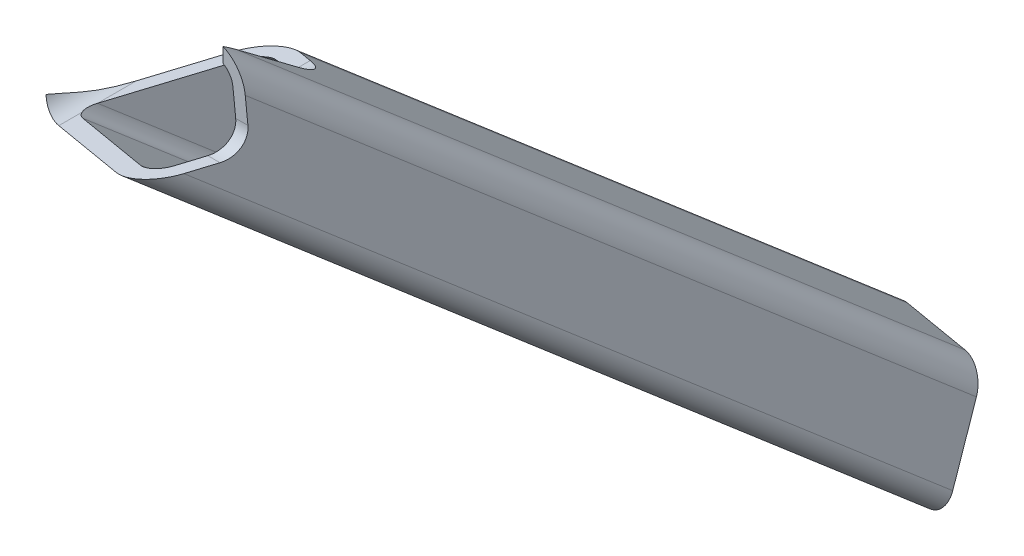
ISO-10303-21;
HEADER;
FILE_DESCRIPTION(('STEP AP214'),'2;1');
FILE_NAME('part.step','',(''),(''),'','','');
FILE_SCHEMA(('AUTOMOTIVE_DESIGN { 1 0 10303 214 1 1 1 1 }'));
ENDSEC;
DATA;
#1=APPLICATION_CONTEXT('core data for automotive mechanical design processes');
#2=APPLICATION_PROTOCOL_DEFINITION('international standard','automotive_design',2000,#1);
#3=PRODUCT_CONTEXT('',#1,'mechanical');
#4=PRODUCT('Part','Part','',(#3));
#5=PRODUCT_RELATED_PRODUCT_CATEGORY('part','',(#4));
#6=PRODUCT_DEFINITION_FORMATION('','',#4);
#7=PRODUCT_DEFINITION_CONTEXT('part definition',#1,'design');
#8=PRODUCT_DEFINITION('design','',#6,#7);
#9=PRODUCT_DEFINITION_SHAPE('','',#8);
#10=(LENGTH_UNIT() NAMED_UNIT(*) SI_UNIT(.MILLI.,.METRE.));
#11=(NAMED_UNIT(*) PLANE_ANGLE_UNIT() SI_UNIT($,.RADIAN.));
#12=(NAMED_UNIT(*) SI_UNIT($,.STERADIAN.) SOLID_ANGLE_UNIT());
#13=UNCERTAINTY_MEASURE_WITH_UNIT(LENGTH_MEASURE(1.E-05),#10,'distance_accuracy_value','');
#14=(GEOMETRIC_REPRESENTATION_CONTEXT(3) GLOBAL_UNCERTAINTY_ASSIGNED_CONTEXT((#13)) GLOBAL_UNIT_ASSIGNED_CONTEXT((#10,
#11,#12)) REPRESENTATION_CONTEXT('',''));
#15=CARTESIAN_POINT('',(0.,0.,0.));
#16=DIRECTION('',(0.,0.,1.));
#17=DIRECTION('',(1.,0.,0.));
#18=AXIS2_PLACEMENT_3D('',#15,#16,#17);
#19=CARTESIAN_POINT('',(-156.509288015,-6.98142396999998,-447.01857603));
#20=DIRECTION('',(0.101857603000028,0.796284793999944,-0.596284793999943));
#21=DIRECTION('',(0.,0.599402291854355,0.800447932422682));
#22=AXIS2_PLACEMENT_3D('',#19,#20,#21);
#23=PLANE('',#22);
#24=DIRECTION('',(0.985721919281302,0.,0.168381405886715));
#25=VECTOR('',#24,1.);
#26=CARTESIAN_POINT('',(-155.840227574181,-10.,-450.935324072141));
#27=LINE('',#26,#25);
#28=CARTESIAN_POINT('',(-155.,-10.,-450.7917960675));
#29=VERTEX_POINT('',#28);
#30=CARTESIAN_POINT('',(-143.,-9.99999999999995,-448.741951348501));
#31=VERTEX_POINT('',#30);
#32=EDGE_CURVE('E463',#29,#31,#27,.T.);
#33=ORIENTED_EDGE('',*,*,#32,.T.);
#34=DIRECTION('',(0.298142396999973,-0.596284793999944,-0.74535599249993));
#35=VECTOR('',#34,1.);
#36=CARTESIAN_POINT('',(-145.120433633,-5.7591327339995,-443.440867266001));
#37=LINE('',#36,#35);
#38=CARTESIAN_POINT('',(-104.,-88.0000000000001,-546.241951348501));
#39=VERTEX_POINT('',#38);
#40=EDGE_CURVE('E402',#31,#39,#37,.T.);
#41=ORIENTED_EDGE('',*,*,#40,.T.);
#42=DIRECTION('',(-0.985721919281302,0.,-0.168381405886715));
#43=VECTOR('',#42,1.);
#44=CARTESIAN_POINT('',(-138.551706806355,-88.0000000000002,-552.144087492619));
#45=LINE('',#44,#43);
#46=CARTESIAN_POINT('',(-116.,-88.0000000000002,-548.291796067501));
#47=VERTEX_POINT('',#46);
#48=EDGE_CURVE('E404',#39,#47,#45,.T.);
#49=ORIENTED_EDGE('',*,*,#48,.T.);
#50=DIRECTION('',(0.298142396999973,-0.596284793999944,-0.74535599249993));
#51=VECTOR('',#50,1.);
#52=CARTESIAN_POINT('',(-156.509288015,-6.98142396999998,-447.01857603));
#53=LINE('',#52,#51);
#54=EDGE_CURVE('E405',#29,#47,#53,.T.);
#55=ORIENTED_EDGE('',*,*,#54,.F.);
#56=EDGE_LOOP('',(#33,#41,#49,#55));
#57=FACE_BOUND('',#56,.T.);
#58=ADVANCED_FACE('F41',(#57),#23,.T.);
#59=CARTESIAN_POINT('',(-144.916718427,-4.16656314599959,-444.633436854));
#60=DIRECTION('',(0.298142396999973,-0.596284793999944,-0.74535599249993));
#61=DIRECTION('',(0.,0.78086880944303,-0.624695047554424));
#62=AXIS2_PLACEMENT_3D('',#59,#60,#61);
#63=CYLINDRICAL_SURFACE('',#62,2.);
#64=ORIENTED_EDGE('',*,*,#40,.F.);
#65=CARTESIAN_POINT('',(-142.,-10.,-451.925232921501));
#66=DIRECTION('',(0.,1.,0.));
#67=DIRECTION('',(0.371390676354104,0.,-0.928476690885259));
#68=AXIS2_PLACEMENT_3D('',#65,#66,#67);
#69=ELLIPSE('',#68,3.35410196624969,2.);
#70=CARTESIAN_POINT('',(-140.,-10.,-451.583592135001));
#71=VERTEX_POINT('',#70);
#72=EDGE_CURVE('E236',#31,#71,#69,.T.);
#73=ORIENTED_EDGE('',*,*,#72,.T.);
#74=DIRECTION('',(0.298142396999973,-0.596284793999944,-0.74535599249993));
#75=VECTOR('',#74,1.);
#76=CARTESIAN_POINT('',(-143.018576030001,-3.96284793999965,-444.03715206));
#77=LINE('',#76,#75);
#78=CARTESIAN_POINT('',(-102.,-86.0000000000003,-546.583592135001));
#79=VERTEX_POINT('',#78);
#80=EDGE_CURVE('E234',#71,#79,#77,.T.);
#81=ORIENTED_EDGE('',*,*,#80,.T.);
#82=CARTESIAN_POINT('',(-104.,-86.0000000000001,-546.925232921501));
#83=DIRECTION('',(0.159575689721233,-0.319151379442464,-0.934172358962716));
#84=DIRECTION('',(0.417774579468394,-0.835549158936787,0.35682208977309));
#85=AXIS2_PLACEMENT_3D('',#82,#83,#84);
#86=ELLIPSE('',#85,2.14093253863854,2.);
#87=EDGE_CURVE('E401',#79,#39,#86,.T.);
#88=ORIENTED_EDGE('',*,*,#87,.T.);
#89=EDGE_LOOP('',(#64,#73,#81,#88));
#90=FACE_BOUND('',#89,.T.);
#91=ADVANCED_FACE('F321',(#90),#63,.F.);
#92=CARTESIAN_POINT('',(-141.796284794,5.59256958799983,-451.192569588));
#93=DIRECTION('',(-0.949071198499986,-0.101857603000028,-0.298142396999973));
#94=DIRECTION('',(-0.299701145927178,0.,0.954033135236893));
#95=AXIS2_PLACEMENT_3D('',#92,#93,#94);
#96=PLANE('',#95);
#97=ORIENTED_EDGE('',*,*,#80,.F.);
#98=DIRECTION('',(0.299701145927178,0.,-0.954033135236893));
#99=VECTOR('',#98,1.);
#100=CARTESIAN_POINT('',(-140.273146748563,-10.,-450.714089123577));
#101=LINE('',#100,#99);
#102=CARTESIAN_POINT('',(-138.612624185539,-10.,-456.));
#103=VERTEX_POINT('',#102);
#104=EDGE_CURVE('E227',#71,#103,#101,.T.);
#105=ORIENTED_EDGE('',*,*,#104,.T.);
#106=CARTESIAN_POINT('',(-139.041918017914,-6.00000000000001,-456.));
#107=DIRECTION('',(-0.949071198499986,-0.101857603000028,-0.298142396999973));
#108=DIRECTION('',(0.31506167678377,-0.306829184502558,-0.898104666149606));
#109=AXIS2_PLACEMENT_3D('',#106,#107,#108);
#110=ELLIPSE('',#109,4.21464691618715,4.);
#111=CARTESIAN_POINT('',(-137.785353083813,-6.,-460.));
#112=VERTEX_POINT('',#111);
#113=EDGE_CURVE('E210',#103,#112,#110,.F.);
#114=ORIENTED_EDGE('',*,*,#113,.T.);
#115=DIRECTION('',(-0.106710653684535,0.9942901168121,0.));
#116=VECTOR('',#115,1.);
#117=CARTESIAN_POINT('',(-139.061013483171,5.88612836390215,-460.));
#118=LINE('',#117,#116);
#119=CARTESIAN_POINT('',(-138.2733126292,-1.45337474160038,-460.));
#120=VERTEX_POINT('',#119);
#121=EDGE_CURVE('E250',#112,#120,#118,.T.);
#122=ORIENTED_EDGE('',*,*,#121,.T.);
#123=DIRECTION('',(0.298142396999973,-0.596284793999944,-0.74535599249993));
#124=VECTOR('',#123,1.);
#125=CARTESIAN_POINT('',(-141.796284794,5.59256958799983,-451.192569588));
#126=LINE('',#125,#124);
#127=CARTESIAN_POINT('',(-102.,-74.0000000000001,-550.683281573));
#128=VERTEX_POINT('',#127);
#129=EDGE_CURVE('E397',#120,#128,#126,.T.);
#130=ORIENTED_EDGE('',*,*,#129,.T.);
#131=DIRECTION('',(0.,-0.94629851540018,0.32329416906498));
#132=VECTOR('',#131,1.);
#133=CARTESIAN_POINT('',(-102.,-33.1638470419887,-564.634576987204));
#134=LINE('',#133,#132);
#135=EDGE_CURVE('E399',#128,#79,#134,.T.);
#136=ORIENTED_EDGE('',*,*,#135,.T.);
#137=EDGE_LOOP('',(#97,#105,#114,#122,#130,#136));
#138=FACE_BOUND('',#137,.T.);
#139=ADVANCED_FACE('F232',(#138),#96,.T.);
#140=CARTESIAN_POINT('',(-143.694427191,5.38885438199968,-451.788854382));
#141=DIRECTION('',(0.298142396999973,-0.596284793999944,-0.74535599249993));
#142=DIRECTION('',(0.,0.78086880944303,-0.624695047554424));
#143=AXIS2_PLACEMENT_3D('',#140,#141,#142);
#144=CYLINDRICAL_SURFACE('',#143,2.);
#145=ORIENTED_EDGE('',*,*,#129,.F.);
#146=CARTESIAN_POINT('',(-140.4099689438,-1.18006211240055,-460.));
#147=DIRECTION('',(0.,0.,1.));
#148=DIRECTION('',(0.447213595499959,-0.894427190999916,0.));
#149=AXIS2_PLACEMENT_3D('',#146,#147,#148);
#150=ELLIPSE('',#149,2.68328157299975,2.);
#151=CARTESIAN_POINT('',(-140.,1.15266891727429,-460.));
#152=VERTEX_POINT('',#151);
#153=EDGE_CURVE('E247',#120,#152,#150,.T.);
#154=ORIENTED_EDGE('',*,*,#153,.T.);
#155=CARTESIAN_POINT('',(-140.,-2.00000000000018,-461.0249223595));
#156=DIRECTION('',(-1.,0.,0.));
#157=DIRECTION('',(0.,-0.624695047554424,-0.780868809443031));
#158=AXIS2_PLACEMENT_3D('',#155,#156,#157);
#159=ELLIPSE('',#158,6.70820393249936,2.);
#160=CARTESIAN_POINT('',(-140.,0.,-461.708203932499));
#161=VERTEX_POINT('',#160);
#162=EDGE_CURVE('E267',#152,#161,#159,.T.);
#163=ORIENTED_EDGE('',*,*,#162,.T.);
#164=DIRECTION('',(0.298142396999973,-0.596284793999944,-0.74535599249993));
#165=VECTOR('',#164,1.);
#166=CARTESIAN_POINT('',(-143.490711985,6.98142396999959,-452.98142397));
#167=LINE('',#166,#165);
#168=CARTESIAN_POINT('',(-104.,-72.0000000000001,-551.708203932499));
#169=VERTEX_POINT('',#168);
#170=EDGE_CURVE('E394',#161,#169,#167,.T.);
#171=ORIENTED_EDGE('',*,*,#170,.T.);
#172=CARTESIAN_POINT('',(-104.,-74.0000000000002,-551.0249223595));
#173=DIRECTION('',(0.159575689721233,-0.319151379442464,-0.934172358962716));
#174=DIRECTION('',(0.417774579468394,-0.835549158936787,0.35682208977309));
#175=AXIS2_PLACEMENT_3D('',#172,#173,#174);
#176=ELLIPSE('',#175,2.14093253863854,2.);
#177=EDGE_CURVE('E396',#169,#128,#176,.T.);
#178=ORIENTED_EDGE('',*,*,#177,.T.);
#179=EDGE_LOOP('',(#145,#154,#163,#171,#178));
#180=FACE_BOUND('',#179,.T.);
#181=ADVANCED_FACE('F332',(#180),#144,.F.);
#182=CARTESIAN_POINT('',(-139.898142397,5.79628479399977,-450.596284794));
#183=DIRECTION('',(-0.949071198499986,-0.101857603000028,-0.298142396999973));
#184=DIRECTION('',(-0.299701145927178,0.,0.954033135236893));
#185=AXIS2_PLACEMENT_3D('',#182,#183,#184);
#186=PLANE('',#185);
#187=DIRECTION('',(0.299701145927178,0.,-0.954033135236893));
#188=VECTOR('',#187,1.);
#189=CARTESIAN_POINT('',(-138.355104720592,-10.,-450.111553034957));
#190=LINE('',#189,#188);
#191=CARTESIAN_POINT('',(-138.,-10.,-451.241951348501));
#192=VERTEX_POINT('',#191);
#193=CARTESIAN_POINT('',(-136.505300727446,-10.,-456.));
#194=VERTEX_POINT('',#193);
#195=EDGE_CURVE('E229',#192,#194,#190,.T.);
#196=ORIENTED_EDGE('',*,*,#195,.F.);
#197=DIRECTION('',(0.298142396999973,-0.596284793999944,-0.74535599249993));
#198=VECTOR('',#197,1.);
#199=CARTESIAN_POINT('',(-141.120433633,-3.7591327339995,-443.440867266001));
#200=LINE('',#199,#198);
#201=CARTESIAN_POINT('',(-100.,-86.0000000000001,-546.241951348501));
#202=VERTEX_POINT('',#201);
#203=EDGE_CURVE('E92',#192,#202,#200,.T.);
#204=ORIENTED_EDGE('',*,*,#203,.T.);
#205=DIRECTION('',(0.,-0.94629851540018,0.32329416906498));
#206=VECTOR('',#205,1.);
#207=CARTESIAN_POINT('',(-100.,-33.0593279222374,-564.32864419498));
#208=LINE('',#207,#206);
#209=CARTESIAN_POINT('',(-100.,-74.0000000000001,-550.3416407865));
#210=VERTEX_POINT('',#209);
#211=EDGE_CURVE('E379',#210,#202,#208,.T.);
#212=ORIENTED_EDGE('',*,*,#211,.F.);
#213=DIRECTION('',(0.298142396999973,-0.596284793999944,-0.74535599249993));
#214=VECTOR('',#213,1.);
#215=CARTESIAN_POINT('',(-139.898142397,5.79628479399977,-450.596284794));
#216=LINE('',#215,#214);
#217=CARTESIAN_POINT('',(-136.1366563146,-1.72668737080025,-460.));
#218=VERTEX_POINT('',#217);
#219=EDGE_CURVE('E374',#218,#210,#216,.T.);
#220=ORIENTED_EDGE('',*,*,#219,.F.);
#221=DIRECTION('',(-0.106710653684535,0.9942901168121,0.));
#222=VECTOR('',#221,1.);
#223=CARTESIAN_POINT('',(-136.977686462074,6.10971822414598,-460.));
#224=LINE('',#223,#222);
#225=CARTESIAN_POINT('',(-135.678029625719,-6.,-460.));
#226=VERTEX_POINT('',#225);
#227=EDGE_CURVE('E245',#226,#218,#224,.T.);
#228=ORIENTED_EDGE('',*,*,#227,.F.);
#229=CARTESIAN_POINT('',(-136.93459455982,-6.00000000000001,-456.));
#230=DIRECTION('',(-0.949071198499986,-0.101857603000028,-0.298142396999973));
#231=DIRECTION('',(0.31506167678377,-0.306829184502558,-0.898104666149606));
#232=AXIS2_PLACEMENT_3D('',#229,#230,#231);
#233=ELLIPSE('',#232,4.21464691618715,4.);
#234=EDGE_CURVE('E221',#194,#226,#233,.F.);
#235=ORIENTED_EDGE('',*,*,#234,.F.);
#236=EDGE_LOOP('',(#196,#204,#212,#220,#228,#235));
#237=FACE_BOUND('',#236,.T.);
#238=ADVANCED_FACE('F335',(#237),#186,.F.);
#239=CARTESIAN_POINT('',(-144.916718427,-4.16656314599959,-444.633436854));
#240=DIRECTION('',(0.298142396999973,-0.596284793999944,-0.74535599249993));
#241=DIRECTION('',(0.,0.78086880944303,-0.624695047554424));
#242=AXIS2_PLACEMENT_3D('',#239,#240,#241);
#243=CYLINDRICAL_SURFACE('',#242,4.);
#244=CARTESIAN_POINT('',(-142.,-10.,-451.925232921501));
#245=DIRECTION('',(0.,1.,0.));
#246=DIRECTION('',(0.371390676354104,0.,-0.928476690885259));
#247=AXIS2_PLACEMENT_3D('',#244,#245,#246);
#248=ELLIPSE('',#247,6.70820393249938,4.);
#249=CARTESIAN_POINT('',(-144.,-10.,-445.558669775502));
#250=VERTEX_POINT('',#249);
#251=EDGE_CURVE('E235',#250,#192,#248,.T.);
#252=ORIENTED_EDGE('',*,*,#251,.F.);
#253=DIRECTION('',(0.298142396999973,-0.596284793999944,-0.74535599249993));
#254=VECTOR('',#253,1.);
#255=CARTESIAN_POINT('',(-145.324148839001,-7.35170232199942,-442.248297678001));
#256=LINE('',#255,#254);
#257=CARTESIAN_POINT('',(-104.,-90.0000000000002,-545.558669775502));
#258=VERTEX_POINT('',#257);
#259=EDGE_CURVE('E101',#250,#258,#256,.T.);
#260=ORIENTED_EDGE('',*,*,#259,.T.);
#261=CARTESIAN_POINT('',(-104.,-86.0000000000001,-546.925232921501));
#262=DIRECTION('',(0.159575689721233,-0.319151379442464,-0.934172358962716));
#263=DIRECTION('',(0.417774579468394,-0.835549158936787,0.35682208977309));
#264=AXIS2_PLACEMENT_3D('',#261,#262,#263);
#265=ELLIPSE('',#264,4.28186507727708,4.);
#266=EDGE_CURVE('E431',#202,#258,#265,.T.);
#267=ORIENTED_EDGE('',*,*,#266,.F.);
#268=ORIENTED_EDGE('',*,*,#203,.F.);
#269=EDGE_LOOP('',(#252,#260,#267,#268));
#270=FACE_BOUND('',#269,.T.);
#271=ADVANCED_FACE('F345',(#270),#243,.T.);
#272=CARTESIAN_POINT('',(-143.694427191,5.38885438199968,-451.788854382));
#273=DIRECTION('',(0.298142396999973,-0.596284793999944,-0.74535599249993));
#274=DIRECTION('',(0.,0.78086880944303,-0.624695047554424));
#275=AXIS2_PLACEMENT_3D('',#272,#273,#274);
#276=CYLINDRICAL_SURFACE('',#275,4.);
#277=CARTESIAN_POINT('',(-140.4099689438,-1.18006211240055,-460.));
#278=DIRECTION('',(0.,0.,1.));
#279=DIRECTION('',(0.447213595499959,-0.894427190999916,0.));
#280=AXIS2_PLACEMENT_3D('',#277,#278,#279);
#281=ELLIPSE('',#280,5.3665631459995,4.);
#282=CARTESIAN_POINT('',(-140.,3.66695933993865,-460.));
#283=VERTEX_POINT('',#282);
#284=EDGE_CURVE('E220',#218,#283,#281,.T.);
#285=ORIENTED_EDGE('',*,*,#284,.F.);
#286=ORIENTED_EDGE('',*,*,#219,.T.);
#287=CARTESIAN_POINT('',(-104.,-74.0000000000002,-551.0249223595));
#288=DIRECTION('',(0.159575689721233,-0.319151379442464,-0.934172358962716));
#289=DIRECTION('',(0.417774579468394,-0.835549158936787,0.35682208977309));
#290=AXIS2_PLACEMENT_3D('',#287,#288,#289);
#291=ELLIPSE('',#290,4.28186507727708,4.);
#292=CARTESIAN_POINT('',(-104.,-70.,-552.391485505499));
#293=VERTEX_POINT('',#292);
#294=EDGE_CURVE('E446',#293,#210,#291,.T.);
#295=ORIENTED_EDGE('',*,*,#294,.F.);
#296=DIRECTION('',(0.298142396999973,-0.596284793999944,-0.74535599249993));
#297=VECTOR('',#296,1.);
#298=CARTESIAN_POINT('',(-143.286996779,8.57399355799951,-454.173993558));
#299=LINE('',#298,#297);
#300=CARTESIAN_POINT('',(-140.,2.00000000000006,-462.391485505499));
#301=VERTEX_POINT('',#300);
#302=EDGE_CURVE('E381',#301,#293,#299,.T.);
#303=ORIENTED_EDGE('',*,*,#302,.F.);
#304=CARTESIAN_POINT('',(-140.,-2.00000000000018,-461.0249223595));
#305=DIRECTION('',(-1.,0.,0.));
#306=DIRECTION('',(0.,-0.624695047554424,-0.780868809443031));
#307=AXIS2_PLACEMENT_3D('',#304,#305,#306);
#308=ELLIPSE('',#307,13.4164078649987,4.);
#309=EDGE_CURVE('E274',#283,#301,#308,.T.);
#310=ORIENTED_EDGE('',*,*,#309,.F.);
#311=EDGE_LOOP('',(#285,#286,#295,#303,#310));
#312=FACE_BOUND('',#311,.T.);
#313=ADVANCED_FACE('F311',(#312),#276,.T.);
#314=CARTESIAN_POINT('',(-140.,-6.00000000000001,-825.));
#315=DIRECTION('',(-1.,0.,0.));
#316=DIRECTION('',(0.,0.,1.));
#317=AXIS2_PLACEMENT_3D('',#314,#315,#316);
#318=PLANE('',#317);
#319=ORIENTED_EDGE('',*,*,#162,.F.);
#320=DIRECTION('',(0.,1.,0.));
#321=VECTOR('',#320,1.);
#322=CARTESIAN_POINT('',(-140.,-6.00000000000001,-460.));
#323=LINE('',#322,#321);
#324=EDGE_CURVE('E11',#152,#283,#323,.T.);
#325=ORIENTED_EDGE('',*,*,#324,.T.);
#326=ORIENTED_EDGE('',*,*,#309,.T.);
#327=DIRECTION('',(0.,-0.599402291854355,-0.800447932422682));
#328=VECTOR('',#327,1.);
#329=CARTESIAN_POINT('',(-140.,8.30459796792715,-453.972261093508));
#330=LINE('',#329,#328);
#331=CARTESIAN_POINT('',(-140.,-6.00000000000001,-473.074767078499));
#332=VERTEX_POINT('',#331);
#333=EDGE_CURVE('E272',#301,#332,#330,.T.);
#334=ORIENTED_EDGE('',*,*,#333,.T.);
#335=DIRECTION('',(0.,0.,1.));
#336=VECTOR('',#335,1.);
#337=CARTESIAN_POINT('',(-140.,-6.00000000000001,-825.));
#338=LINE('',#337,#336);
#339=CARTESIAN_POINT('',(-140.,-6.00000000000001,-469.720665112249));
#340=VERTEX_POINT('',#339);
#341=EDGE_CURVE('E259',#332,#340,#338,.T.);
#342=ORIENTED_EDGE('',*,*,#341,.T.);
#343=DIRECTION('',(0.,-0.599402291854355,-0.800447932422682));
#344=VECTOR('',#343,1.);
#345=CARTESIAN_POINT('',(-140.,6.69533229477203,-452.767188916268));
#346=LINE('',#345,#344);
#347=EDGE_CURVE('E269',#161,#340,#346,.T.);
#348=ORIENTED_EDGE('',*,*,#347,.F.);
#349=EDGE_LOOP('',(#319,#325,#326,#334,#342,#348));
#350=FACE_BOUND('',#349,.T.);
#351=ADVANCED_FACE('F308',(#350),#318,.T.);
#352=CARTESIAN_POINT('',(-158.203715206,-5.592569588,-448.807430412));
#353=DIRECTION('',(0.949071198499986,0.101857603000028,0.298142396999973));
#354=DIRECTION('',(0.299701145927178,0.,-0.954033135236893));
#355=AXIS2_PLACEMENT_3D('',#352,#353,#354);
#356=PLANE('',#355);
#357=DIRECTION('',(0.298142396999973,-0.596284793999944,-0.74535599249993));
#358=VECTOR('',#357,1.);
#359=CARTESIAN_POINT('',(-156.98142397,3.96284793999926,-455.962847939999));
#360=LINE('',#359,#358);
#361=CARTESIAN_POINT('',(-150.,-10.,-473.416407864998));
#362=VERTEX_POINT('',#361);
#363=CARTESIAN_POINT('',(-118.,-74.0000000000002,-553.416407864999));
#364=VERTEX_POINT('',#363);
#365=EDGE_CURVE('E411',#362,#364,#360,.T.);
#366=ORIENTED_EDGE('',*,*,#365,.F.);
#367=DIRECTION('',(-0.299701145927178,0.,0.954033135236893));
#368=VECTOR('',#367,1.);
#369=CARTESIAN_POINT('',(-157.773181617213,-10.,-448.672182059344));
#370=LINE('',#369,#368);
#371=CARTESIAN_POINT('',(-156.,-10.,-454.316718427));
#372=VERTEX_POINT('',#371);
#373=EDGE_CURVE('E49',#362,#372,#370,.T.);
#374=ORIENTED_EDGE('',*,*,#373,.T.);
#375=DIRECTION('',(0.298142396999973,-0.596284793999944,-0.74535599249993));
#376=VECTOR('',#375,1.);
#377=CARTESIAN_POINT('',(-158.203715206,-5.592569588,-448.807430412));
#378=LINE('',#377,#376);
#379=CARTESIAN_POINT('',(-118.,-86.0000000000002,-549.316718427));
#380=VERTEX_POINT('',#379);
#381=EDGE_CURVE('E408',#372,#380,#378,.T.);
#382=ORIENTED_EDGE('',*,*,#381,.T.);
#383=DIRECTION('',(0.,0.94629851540018,-0.32329416906498));
#384=VECTOR('',#383,1.);
#385=CARTESIAN_POINT('',(-118.,-44.7457705629831,-563.410845818309));
#386=LINE('',#385,#384);
#387=EDGE_CURVE('E410',#380,#364,#386,.T.);
#388=ORIENTED_EDGE('',*,*,#387,.T.);
#389=EDGE_LOOP('',(#366,#374,#382,#388));
#390=FACE_BOUND('',#389,.T.);
#391=ADVANCED_FACE('F310',(#390),#356,.T.);
#392=CARTESIAN_POINT('',(-156.305572809,-5.38885438200007,-448.211145618));
#393=DIRECTION('',(0.298142396999973,-0.596284793999944,-0.74535599249993));
#394=DIRECTION('',(0.,0.78086880944303,-0.624695047554424));
#395=AXIS2_PLACEMENT_3D('',#392,#393,#394);
#396=CYLINDRICAL_SURFACE('',#395,2.);
#397=CARTESIAN_POINT('',(-156.,-10.0000000000001,-454.316718427));
#398=CARTESIAN_POINT('',(-156.022656823145,-9.99999754269651,-454.24456489646));
#399=CARTESIAN_POINT('',(-156.043872084251,-9.99980735809923,-454.171956861477));
#400=CARTESIAN_POINT('',(-156.083318443158,-9.9991814897276,-454.025917321129));
#401=CARTESIAN_POINT('',(-156.101548818444,-9.99874574662695,-453.952485620974));
#402=CARTESIAN_POINT('',(-156.134993255057,-9.99775647888816,-453.804565689456));
#403=CARTESIAN_POINT('',(-156.150192443177,-9.99720239983273,-453.730074081384));
#404=CARTESIAN_POINT('',(-156.177282324072,-9.99609230758347,-453.58050174071));
#405=CARTESIAN_POINT('',(-156.189173268895,-9.99553629454025,-453.505421053439));
#406=CARTESIAN_POINT('',(-156.218660349006,-9.99406745938887,-453.28610623523));
#407=CARTESIAN_POINT('',(-156.231580702871,-9.99329122294913,-453.141204130407));
#408=CARTESIAN_POINT('',(-156.24224201697,-9.99266469593608,-452.850989110395));
#409=CARTESIAN_POINT('',(-156.240011802375,-9.99281264697881,-452.70567750081));
#410=CARTESIAN_POINT('',(-156.222438330699,-9.99381322689165,-452.482273598348));
#411=CARTESIAN_POINT('',(-156.213519104223,-9.99431482580725,-452.403661999389));
#412=CARTESIAN_POINT('',(-156.189648448054,-9.99551971235196,-452.247394124348));
#413=CARTESIAN_POINT('',(-156.17470107311,-9.9962228643174,-452.169737242199));
#414=CARTESIAN_POINT('',(-156.137726287486,-9.99767419087623,-452.014135267174));
#415=CARTESIAN_POINT('',(-156.115538445014,-9.9984230394264,-451.936227513888));
#416=CARTESIAN_POINT('',(-156.063593743387,-9.99957116836077,-451.782770850176));
#417=CARTESIAN_POINT('',(-156.033817989829,-9.99996956490751,-451.707228364534));
#418=CARTESIAN_POINT('',(-156.,-10.,-451.633436854));
#419=B_SPLINE_CURVE_WITH_KNOTS('',3,(#397,#398,#399,#400,#401,#402,#403,#404,#405,#406,#407,
#408,#409,#410,#411,#412,#413,#414,#415,#416,#417,#418),.UNSPECIFIED.,.F.,.F.,(4,2,2,2,2,2,2,2,
2,2,4),(0.,0.22686819326887,0.453791220835796,0.681801692033421,0.909794786803097,
1.34555621847641,1.78048881158996,2.01764524139642,2.25464241654067,2.49729477876087,
2.7405573683292),.UNSPECIFIED.);
#420=CARTESIAN_POINT('',(-156.,-10.,-451.633436854));
#421=VERTEX_POINT('',#420);
#422=EDGE_CURVE('E276',#372,#421,#419,.T.);
#423=ORIENTED_EDGE('',*,*,#422,.T.);
#424=CARTESIAN_POINT('',(-154.,-10.,-453.9750776405));
#425=DIRECTION('',(0.,1.,0.));
#426=DIRECTION('',(0.371390676354104,0.,-0.928476690885259));
#427=AXIS2_PLACEMENT_3D('',#424,#425,#426);
#428=ELLIPSE('',#427,3.35410196624969,2.);
#429=EDGE_CURVE('E474',#421,#29,#428,.T.);
#430=ORIENTED_EDGE('',*,*,#429,.T.);
#431=ORIENTED_EDGE('',*,*,#54,.T.);
#432=CARTESIAN_POINT('',(-116.,-86.0000000000002,-548.9750776405));
#433=DIRECTION('',(0.159575689721233,-0.319151379442464,-0.934172358962716));
#434=DIRECTION('',(0.417774579468394,-0.835549158936787,0.35682208977309));
#435=AXIS2_PLACEMENT_3D('',#432,#433,#434);
#436=ELLIPSE('',#435,2.14093253863854,2.);
#437=EDGE_CURVE('E407',#47,#380,#436,.T.);
#438=ORIENTED_EDGE('',*,*,#437,.T.);
#439=ORIENTED_EDGE('',*,*,#381,.F.);
#440=EDGE_LOOP('',(#423,#430,#431,#438,#439));
#441=FACE_BOUND('',#440,.T.);
#442=ADVANCED_FACE('F287',(#441),#396,.F.);
#443=CARTESIAN_POINT('',(-143.490711985,6.98142396999959,-452.98142397));
#444=DIRECTION('',(-0.101857603000028,-0.796284793999944,0.596284793999943));
#445=DIRECTION('',(0.,-0.599402291854355,-0.800447932422682));
#446=AXIS2_PLACEMENT_3D('',#443,#444,#445);
#447=PLANE('',#446);
#448=ORIENTED_EDGE('',*,*,#170,.F.);
#449=ORIENTED_EDGE('',*,*,#347,.T.);
#450=CARTESIAN_POINT('',(-144.,-6.00000000000001,-470.403946685249));
#451=DIRECTION('',(-0.101857603000028,-0.796284793999944,0.596284793999943));
#452=DIRECTION('',(0.0756579281399765,0.591465496428254,0.802772971919487));
#453=AXIS2_PLACEMENT_3D('',#450,#451,#452);
#454=ELLIPSE('',#453,6.70820393249938,4.);
#455=CARTESIAN_POINT('',(-144.,-10.,-475.745587471749));
#456=VERTEX_POINT('',#455);
#457=EDGE_CURVE('E262',#340,#456,#454,.F.);
#458=ORIENTED_EDGE('',*,*,#457,.T.);
#459=DIRECTION('',(-0.985721919281302,0.,-0.168381405886715));
#460=VECTOR('',#459,1.);
#461=CARTESIAN_POINT('',(-139.726818382787,-10.,-475.015640907468));
#462=LINE('',#461,#460);
#463=CARTESIAN_POINT('',(-147.,-10.,-476.258048651498));
#464=VERTEX_POINT('',#463);
#465=EDGE_CURVE('E472',#456,#464,#462,.T.);
#466=ORIENTED_EDGE('',*,*,#465,.T.);
#467=DIRECTION('',(0.298142396999973,-0.596284793999944,-0.74535599249993));
#468=VECTOR('',#467,1.);
#469=CARTESIAN_POINT('',(-154.879566367,5.75913273399911,-456.559132733999));
#470=LINE('',#469,#468);
#471=CARTESIAN_POINT('',(-116.,-72.0000000000002,-553.758048651499));
#472=VERTEX_POINT('',#471);
#473=EDGE_CURVE('E64',#464,#472,#470,.T.);
#474=ORIENTED_EDGE('',*,*,#473,.T.);
#475=DIRECTION('',(0.985721919281302,0.,0.168381405886715));
#476=VECTOR('',#475,1.);
#477=CARTESIAN_POINT('',(-125.984660849387,-72.0000000000001,-555.463632344258));
#478=LINE('',#477,#476);
#479=EDGE_CURVE('E392',#472,#169,#478,.T.);
#480=ORIENTED_EDGE('',*,*,#479,.T.);
#481=EDGE_LOOP('',(#448,#449,#458,#466,#474,#480));
#482=FACE_BOUND('',#481,.T.);
#483=ADVANCED_FACE('F318',(#482),#447,.T.);
#484=CARTESIAN_POINT('',(-155.083281573,4.16656314599942,-455.366563145999));
#485=DIRECTION('',(0.298142396999973,-0.596284793999944,-0.74535599249993));
#486=DIRECTION('',(0.,0.78086880944303,-0.624695047554424));
#487=AXIS2_PLACEMENT_3D('',#484,#485,#486);
#488=CYLINDRICAL_SURFACE('',#487,2.);
#489=ORIENTED_EDGE('',*,*,#473,.F.);
#490=CARTESIAN_POINT('',(-148.,-10.,-473.074767078499));
#491=DIRECTION('',(0.,1.,0.));
#492=DIRECTION('',(0.371390676354104,0.,-0.928476690885259));
#493=AXIS2_PLACEMENT_3D('',#490,#491,#492);
#494=ELLIPSE('',#493,3.35410196624969,2.);
#495=EDGE_CURVE('E467',#464,#362,#494,.T.);
#496=ORIENTED_EDGE('',*,*,#495,.T.);
#497=ORIENTED_EDGE('',*,*,#365,.T.);
#498=CARTESIAN_POINT('',(-116.,-74.0000000000001,-553.074767078499));
#499=DIRECTION('',(0.159575689721233,-0.319151379442464,-0.934172358962716));
#500=DIRECTION('',(0.417774579468394,-0.835549158936787,0.35682208977309));
#501=AXIS2_PLACEMENT_3D('',#498,#499,#500);
#502=ELLIPSE('',#501,2.14093253863854,2.);
#503=EDGE_CURVE('E393',#364,#472,#502,.T.);
#504=ORIENTED_EDGE('',*,*,#503,.T.);
#505=EDGE_LOOP('',(#489,#496,#497,#504));
#506=FACE_BOUND('',#505,.T.);
#507=ADVANCED_FACE('F339',(#506),#488,.F.);
#508=CARTESIAN_POINT('',(-110.,-80.,-550.));
#509=DIRECTION('',(0.159575689721233,-0.319151379442464,-0.934172358962716));
#510=DIRECTION('',(0.,0.94629851540018,-0.32329416906498));
#511=AXIS2_PLACEMENT_3D('',#508,#509,#510);
#512=PLANE('',#511);
#513=ORIENTED_EDGE('',*,*,#503,.F.);
#514=ORIENTED_EDGE('',*,*,#387,.F.);
#515=ORIENTED_EDGE('',*,*,#437,.F.);
#516=ORIENTED_EDGE('',*,*,#48,.F.);
#517=ORIENTED_EDGE('',*,*,#87,.F.);
#518=ORIENTED_EDGE('',*,*,#135,.F.);
#519=ORIENTED_EDGE('',*,*,#177,.F.);
#520=ORIENTED_EDGE('',*,*,#479,.F.);
#521=EDGE_LOOP('',(#513,#514,#515,#516,#517,#518,#519,#520));
#522=FACE_BOUND('',#521,.T.);
#523=DIRECTION('',(0.985721919281302,0.,0.168381405886715));
#524=VECTOR('',#523,1.);
#525=CARTESIAN_POINT('',(-125.871251657994,-70.,-556.127541314586));
#526=LINE('',#525,#524);
#527=CARTESIAN_POINT('',(-116.,-70.0000000000002,-554.441330224498));
#528=VERTEX_POINT('',#527);
#529=EDGE_CURVE('E423',#528,#293,#526,.T.);
#530=ORIENTED_EDGE('',*,*,#529,.T.);
#531=ORIENTED_EDGE('',*,*,#294,.T.);
#532=ORIENTED_EDGE('',*,*,#211,.T.);
#533=ORIENTED_EDGE('',*,*,#266,.T.);
#534=DIRECTION('',(-0.985721919281302,0.,-0.168381405886715));
#535=VECTOR('',#534,1.);
#536=CARTESIAN_POINT('',(-138.665115997749,-90.0000000000001,-551.480178522292));
#537=LINE('',#536,#535);
#538=CARTESIAN_POINT('',(-116.,-90.0000000000001,-547.608514494501));
#539=VERTEX_POINT('',#538);
#540=EDGE_CURVE('E428',#258,#539,#537,.T.);
#541=ORIENTED_EDGE('',*,*,#540,.T.);
#542=CARTESIAN_POINT('',(-116.,-86.0000000000002,-548.9750776405));
#543=DIRECTION('',(0.159575689721233,-0.319151379442464,-0.934172358962716));
#544=DIRECTION('',(0.417774579468394,-0.835549158936787,0.35682208977309));
#545=AXIS2_PLACEMENT_3D('',#542,#543,#544);
#546=ELLIPSE('',#545,4.28186507727708,4.);
#547=CARTESIAN_POINT('',(-120.,-86.0000000000002,-549.6583592135));
#548=VERTEX_POINT('',#547);
#549=EDGE_CURVE('E420',#539,#548,#546,.T.);
#550=ORIENTED_EDGE('',*,*,#549,.T.);
#551=DIRECTION('',(0.,0.94629851540018,-0.32329416906498));
#552=VECTOR('',#551,1.);
#553=CARTESIAN_POINT('',(-120.,-44.8502896827346,-563.716778610533));
#554=LINE('',#553,#552);
#555=CARTESIAN_POINT('',(-120.,-74.0000000000001,-553.758048651499));
#556=VERTEX_POINT('',#555);
#557=EDGE_CURVE('E414',#548,#556,#554,.T.);
#558=ORIENTED_EDGE('',*,*,#557,.T.);
#559=CARTESIAN_POINT('',(-116.,-74.0000000000001,-553.074767078499));
#560=DIRECTION('',(0.159575689721233,-0.319151379442464,-0.934172358962716));
#561=DIRECTION('',(0.417774579468394,-0.835549158936787,0.35682208977309));
#562=AXIS2_PLACEMENT_3D('',#559,#560,#561);
#563=ELLIPSE('',#562,4.28186507727708,4.);
#564=EDGE_CURVE('E412',#556,#528,#563,.T.);
#565=ORIENTED_EDGE('',*,*,#564,.T.);
#566=EDGE_LOOP('',(#530,#531,#532,#533,#541,#550,#558,#565));
#567=FACE_BOUND('',#566,.T.);
#568=ADVANCED_FACE('F43',(#522,#567),#512,.T.);
#569=CARTESIAN_POINT('',(-156.713003221,-8.57399355799968,-445.826006442));
#570=DIRECTION('',(0.101857603000028,0.796284793999944,-0.596284793999943));
#571=DIRECTION('',(0.,0.599402291854355,0.800447932422682));
#572=AXIS2_PLACEMENT_3D('',#569,#570,#571);
#573=PLANE('',#572);
#574=DIRECTION('',(0.985721919281302,0.,0.168381405886715));
#575=VECTOR('',#574,1.);
#576=CARTESIAN_POINT('',(-156.396932169878,-10.,-447.676318603853));
#577=LINE('',#576,#575);
#578=CARTESIAN_POINT('',(-156.,-10.,-447.608514494501));
#579=VERTEX_POINT('',#578);
#580=EDGE_CURVE('E461',#579,#250,#577,.T.);
#581=ORIENTED_EDGE('',*,*,#580,.F.);
#582=DIRECTION('',(0.298142396999973,-0.596284793999944,-0.74535599249993));
#583=VECTOR('',#582,1.);
#584=CARTESIAN_POINT('',(-156.713003221,-8.57399355799968,-445.826006442));
#585=LINE('',#584,#583);
#586=EDGE_CURVE('E108',#579,#539,#585,.T.);
#587=ORIENTED_EDGE('',*,*,#586,.T.);
#588=ORIENTED_EDGE('',*,*,#540,.F.);
#589=ORIENTED_EDGE('',*,*,#259,.F.);
#590=EDGE_LOOP('',(#581,#587,#588,#589));
#591=FACE_BOUND('',#590,.T.);
#592=ADVANCED_FACE('F348',(#591),#573,.F.);
#593=CARTESIAN_POINT('',(-156.305572809,-5.38885438200007,-448.211145618));
#594=DIRECTION('',(0.298142396999973,-0.596284793999944,-0.74535599249993));
#595=DIRECTION('',(0.,0.78086880944303,-0.624695047554424));
#596=AXIS2_PLACEMENT_3D('',#593,#594,#595);
#597=CYLINDRICAL_SURFACE('',#596,4.);
#598=CARTESIAN_POINT('',(-156.,-6.00000000000003,-448.9750776405));
#599=DIRECTION('',(0.417774579468394,-0.835549158936786,0.35682208977309));
#600=DIRECTION('',(0.159575689721233,-0.319151379442465,-0.934172358962716));
#601=AXIS2_PLACEMENT_3D('',#598,#599,#600);
#602=ELLIPSE('',#601,11.2100683075526,4.);
#603=CARTESIAN_POINT('',(-158.4,-9.20000000000011,-453.6583592135));
#604=VERTEX_POINT('',#603);
#605=CARTESIAN_POINT('',(-159.577708764,-7.78885438199987,-448.9750776405));
#606=VERTEX_POINT('',#605);
#607=EDGE_CURVE('E457',#604,#606,#602,.F.);
#608=ORIENTED_EDGE('',*,*,#607,.F.);
#609=DIRECTION('',(0.298142396999973,-0.596284793999944,-0.74535599249993));
#610=VECTOR('',#609,1.);
#611=CARTESIAN_POINT('',(-160.101857603,-5.79628479400016,-449.403715206));
#612=LINE('',#611,#610);
#613=EDGE_CURVE('E451',#604,#548,#612,.T.);
#614=ORIENTED_EDGE('',*,*,#613,.T.);
#615=ORIENTED_EDGE('',*,*,#549,.F.);
#616=ORIENTED_EDGE('',*,*,#586,.F.);
#617=CARTESIAN_POINT('',(-156.,-6.00000000000003,-448.9750776405));
#618=DIRECTION('',(0.159575689721233,-0.319151379442465,-0.934172358962716));
#619=DIRECTION('',(0.417774579468394,-0.835549158936786,0.35682208977309));
#620=AXIS2_PLACEMENT_3D('',#617,#618,#619);
#621=ELLIPSE('',#620,4.28186507727708,4.);
#622=EDGE_CURVE('E285',#606,#579,#621,.F.);
#623=ORIENTED_EDGE('',*,*,#622,.F.);
#624=EDGE_LOOP('',(#608,#614,#615,#616,#623));
#625=FACE_BOUND('',#624,.T.);
#626=ADVANCED_FACE('F351',(#625),#597,.T.);
#627=CARTESIAN_POINT('',(-160.101857603,-5.79628479400016,-449.403715206));
#628=DIRECTION('',(0.949071198499986,0.101857603000028,0.298142396999973));
#629=DIRECTION('',(0.299701145927178,0.,-0.954033135236893));
#630=AXIS2_PLACEMENT_3D('',#627,#628,#629);
#631=PLANE('',#630);
#632=DIRECTION('',(-0.299701145927178,0.,0.954033135236893));
#633=VECTOR('',#632,1.);
#634=CARTESIAN_POINT('',(-159.691223645184,-10.,-449.274718147964));
#635=LINE('',#634,#633);
#636=CARTESIAN_POINT('',(-152.,-10.,-473.758048651498));
#637=VERTEX_POINT('',#636);
#638=CARTESIAN_POINT('',(-156.,-10.,-461.0249223595));
#639=VERTEX_POINT('',#638);
#640=EDGE_CURVE('E462',#637,#639,#635,.T.);
#641=ORIENTED_EDGE('',*,*,#640,.F.);
#642=DIRECTION('',(0.298142396999973,-0.596284793999944,-0.74535599249993));
#643=VECTOR('',#642,1.);
#644=CARTESIAN_POINT('',(-158.879566367,3.75913273399933,-456.559132733999));
#645=LINE('',#644,#643);
#646=EDGE_CURVE('E449',#637,#556,#645,.T.);
#647=ORIENTED_EDGE('',*,*,#646,.T.);
#648=ORIENTED_EDGE('',*,*,#557,.F.);
#649=ORIENTED_EDGE('',*,*,#613,.F.);
#650=CARTESIAN_POINT('',(-156.,-6.00000000000001,-462.391485505499));
#651=DIRECTION('',(0.949071198499986,0.101857603000028,0.298142396999973));
#652=DIRECTION('',(-0.296440038739742,-0.0318149700749413,0.954521404218423));
#653=AXIS2_PLACEMENT_3D('',#650,#651,#652);
#654=ELLIPSE('',#653,13.4164078649987,4.);
#655=EDGE_CURVE('E466',#639,#604,#654,.F.);
#656=ORIENTED_EDGE('',*,*,#655,.F.);
#657=EDGE_LOOP('',(#641,#647,#648,#649,#656));
#658=FACE_BOUND('',#657,.T.);
#659=ADVANCED_FACE('F354',(#658),#631,.F.);
#660=CARTESIAN_POINT('',(-155.083281573,4.16656314599942,-455.366563145999));
#661=DIRECTION('',(0.298142396999973,-0.596284793999944,-0.74535599249993));
#662=DIRECTION('',(0.,0.78086880944303,-0.624695047554424));
#663=AXIS2_PLACEMENT_3D('',#660,#661,#662);
#664=CYLINDRICAL_SURFACE('',#663,4.);
#665=CARTESIAN_POINT('',(-148.,-10.,-473.074767078499));
#666=DIRECTION('',(0.,1.,0.));
#667=DIRECTION('',(0.371390676354104,0.,-0.928476690885259));
#668=AXIS2_PLACEMENT_3D('',#665,#666,#667);
#669=ELLIPSE('',#668,6.70820393249938,4.);
#670=CARTESIAN_POINT('',(-146.,-10.,-479.441330224498));
#671=VERTEX_POINT('',#670);
#672=EDGE_CURVE('E386',#671,#637,#669,.T.);
#673=ORIENTED_EDGE('',*,*,#672,.F.);
#674=DIRECTION('',(0.298142396999973,-0.596284793999944,-0.74535599249993));
#675=VECTOR('',#674,1.);
#676=CARTESIAN_POINT('',(-154.675851161,7.35170232199903,-457.751702321999));
#677=LINE('',#676,#675);
#678=EDGE_CURVE('E384',#671,#528,#677,.T.);
#679=ORIENTED_EDGE('',*,*,#678,.T.);
#680=ORIENTED_EDGE('',*,*,#564,.F.);
#681=ORIENTED_EDGE('',*,*,#646,.F.);
#682=EDGE_LOOP('',(#673,#679,#680,#681));
#683=FACE_BOUND('',#682,.T.);
#684=ADVANCED_FACE('F358',(#683),#664,.T.);
#685=CARTESIAN_POINT('',(-143.286996779,8.57399355799951,-454.173993558));
#686=DIRECTION('',(-0.101857603000028,-0.796284793999944,0.596284793999943));
#687=DIRECTION('',(0.,-0.599402291854355,-0.800447932422682));
#688=AXIS2_PLACEMENT_3D('',#685,#686,#687);
#689=PLANE('',#688);
#690=ORIENTED_EDGE('',*,*,#333,.F.);
#691=ORIENTED_EDGE('',*,*,#302,.T.);
#692=ORIENTED_EDGE('',*,*,#529,.F.);
#693=ORIENTED_EDGE('',*,*,#678,.F.);
#694=DIRECTION('',(-0.985721919281302,0.,-0.168381405886715));
#695=VECTOR('',#694,1.);
#696=CARTESIAN_POINT('',(-139.17011378709,-10.,-478.274646375757));
#697=LINE('',#696,#695);
#698=CARTESIAN_POINT('',(-144.,-10.,-479.099689437998));
#699=VERTEX_POINT('',#698);
#700=EDGE_CURVE('E382',#699,#671,#697,.T.);
#701=ORIENTED_EDGE('',*,*,#700,.F.);
#702=CARTESIAN_POINT('',(-144.,-6.00000000000001,-473.758048651499));
#703=DIRECTION('',(-0.101857603000028,-0.796284793999944,0.596284793999943));
#704=DIRECTION('',(0.0756579281399765,0.591465496428254,0.802772971919487));
#705=AXIS2_PLACEMENT_3D('',#702,#703,#704);
#706=ELLIPSE('',#705,6.70820393249938,4.);
#707=EDGE_CURVE('E265',#332,#699,#706,.F.);
#708=ORIENTED_EDGE('',*,*,#707,.F.);
#709=EDGE_LOOP('',(#690,#691,#692,#693,#701,#708));
#710=FACE_BOUND('',#709,.T.);
#711=ADVANCED_FACE('F302',(#710),#689,.F.);
#712=CARTESIAN_POINT('',(-144.,-10.,-825.));
#713=DIRECTION('',(0.,1.,0.));
#714=DIRECTION('',(0.,0.,1.));
#715=AXIS2_PLACEMENT_3D('',#712,#713,#714);
#716=PLANE('',#715);
#717=DIRECTION('',(0.,0.,1.));
#718=VECTOR('',#717,1.);
#719=CARTESIAN_POINT('',(-156.,-10.,-825.));
#720=LINE('',#719,#718);
#721=EDGE_CURVE('E255',#639,#372,#720,.T.);
#722=ORIENTED_EDGE('',*,*,#721,.T.);
#723=ORIENTED_EDGE('',*,*,#373,.F.);
#724=ORIENTED_EDGE('',*,*,#495,.F.);
#725=ORIENTED_EDGE('',*,*,#465,.F.);
#726=DIRECTION('',(0.,0.,1.));
#727=VECTOR('',#726,1.);
#728=CARTESIAN_POINT('',(-144.,-10.,-825.));
#729=LINE('',#728,#727);
#730=EDGE_CURVE('E256',#699,#456,#729,.T.);
#731=ORIENTED_EDGE('',*,*,#730,.F.);
#732=ORIENTED_EDGE('',*,*,#700,.T.);
#733=ORIENTED_EDGE('',*,*,#672,.T.);
#734=ORIENTED_EDGE('',*,*,#640,.T.);
#735=EDGE_LOOP('',(#722,#723,#724,#725,#731,#732,#733,#734));
#736=FACE_BOUND('',#735,.T.);
#737=ADVANCED_FACE('F296',(#736),#716,.T.);
#738=CARTESIAN_POINT('',(-156.,-6.00000000000001,-825.));
#739=DIRECTION('',(0.,0.,1.));
#740=DIRECTION('',(1.,0.,0.));
#741=AXIS2_PLACEMENT_3D('',#738,#739,#740);
#742=CYLINDRICAL_SURFACE('',#741,4.);
#743=ORIENTED_EDGE('',*,*,#422,.F.);
#744=ORIENTED_EDGE('',*,*,#721,.F.);
#745=ORIENTED_EDGE('',*,*,#655,.T.);
#746=ORIENTED_EDGE('',*,*,#607,.T.);
#747=ORIENTED_EDGE('',*,*,#622,.T.);
#748=EDGE_CURVE('E252',#421,#579,#720,.T.);
#749=ORIENTED_EDGE('',*,*,#748,.F.);
#750=EDGE_LOOP('',(#743,#744,#745,#746,#747,#749));
#751=FACE_BOUND('',#750,.T.);
#752=ADVANCED_FACE('F291',(#751),#742,.F.);
#753=ORIENTED_EDGE('',*,*,#580,.T.);
#754=ORIENTED_EDGE('',*,*,#251,.T.);
#755=ORIENTED_EDGE('',*,*,#195,.T.);
#756=DIRECTION('',(1.,0.,0.));
#757=VECTOR('',#756,1.);
#758=CARTESIAN_POINT('',(-150.,-10.,-456.));
#759=LINE('',#758,#757);
#760=EDGE_CURVE('E213',#103,#194,#759,.T.);
#761=ORIENTED_EDGE('',*,*,#760,.F.);
#762=ORIENTED_EDGE('',*,*,#104,.F.);
#763=ORIENTED_EDGE('',*,*,#72,.F.);
#764=ORIENTED_EDGE('',*,*,#32,.F.);
#765=ORIENTED_EDGE('',*,*,#429,.F.);
#766=ORIENTED_EDGE('',*,*,#748,.T.);
#767=EDGE_LOOP('',(#753,#754,#755,#761,#762,#763,#764,#765,#766));
#768=FACE_BOUND('',#767,.T.);
#769=ADVANCED_FACE('F225',(#768),#716,.T.);
#770=CARTESIAN_POINT('',(-144.,-6.00000000000001,-825.));
#771=DIRECTION('',(0.,0.,1.));
#772=DIRECTION('',(1.,0.,0.));
#773=AXIS2_PLACEMENT_3D('',#770,#771,#772);
#774=CYLINDRICAL_SURFACE('',#773,4.);
#775=ORIENTED_EDGE('',*,*,#707,.T.);
#776=ORIENTED_EDGE('',*,*,#730,.T.);
#777=ORIENTED_EDGE('',*,*,#457,.F.);
#778=ORIENTED_EDGE('',*,*,#341,.F.);
#779=EDGE_LOOP('',(#775,#776,#777,#778));
#780=FACE_BOUND('',#779,.T.);
#781=ADVANCED_FACE('F304',(#780),#774,.F.);
#782=CARTESIAN_POINT('',(-150.,-6.00000000000001,-456.));
#783=DIRECTION('',(1.,0.,0.));
#784=DIRECTION('',(0.,0.,-1.));
#785=AXIS2_PLACEMENT_3D('',#782,#783,#784);
#786=CYLINDRICAL_SURFACE('',#785,4.);
#787=ORIENTED_EDGE('',*,*,#760,.T.);
#788=ORIENTED_EDGE('',*,*,#234,.T.);
#789=DIRECTION('',(1.,0.,0.));
#790=VECTOR('',#789,1.);
#791=CARTESIAN_POINT('',(-150.,-6.00000000000001,-460.));
#792=LINE('',#791,#790);
#793=EDGE_CURVE('E216',#112,#226,#792,.T.);
#794=ORIENTED_EDGE('',*,*,#793,.F.);
#795=ORIENTED_EDGE('',*,*,#113,.F.);
#796=EDGE_LOOP('',(#787,#788,#794,#795));
#797=FACE_BOUND('',#796,.T.);
#798=ADVANCED_FACE('F212',(#797),#786,.F.);
#799=CARTESIAN_POINT('',(-150.,-6.00000000000001,-460.));
#800=DIRECTION('',(0.,0.,1.));
#801=DIRECTION('',(1.,0.,0.));
#802=AXIS2_PLACEMENT_3D('',#799,#800,#801);
#803=PLANE('',#802);
#804=ORIENTED_EDGE('',*,*,#793,.T.);
#805=ORIENTED_EDGE('',*,*,#227,.T.);
#806=ORIENTED_EDGE('',*,*,#284,.T.);
#807=ORIENTED_EDGE('',*,*,#324,.F.);
#808=ORIENTED_EDGE('',*,*,#153,.F.);
#809=ORIENTED_EDGE('',*,*,#121,.F.);
#810=EDGE_LOOP('',(#804,#805,#806,#807,#808,#809));
#811=FACE_BOUND('',#810,.T.);
#812=ADVANCED_FACE('F298',(#811),#803,.T.);
#813=CLOSED_SHELL('',(#58,#91,#139,#181,#238,#271,#313,#351,#391,#442,#483,#507,#568,#592,#626,
#659,#684,#711,#737,#752,#769,#781,#798,#812));
#814=MANIFOLD_SOLID_BREP('B2',#813);
#815=ADVANCED_BREP_SHAPE_REPRESENTATION('',(#18,#814),#14);
#816=SHAPE_DEFINITION_REPRESENTATION(#9,#815);
ENDSEC;
END-ISO-10303-21;
